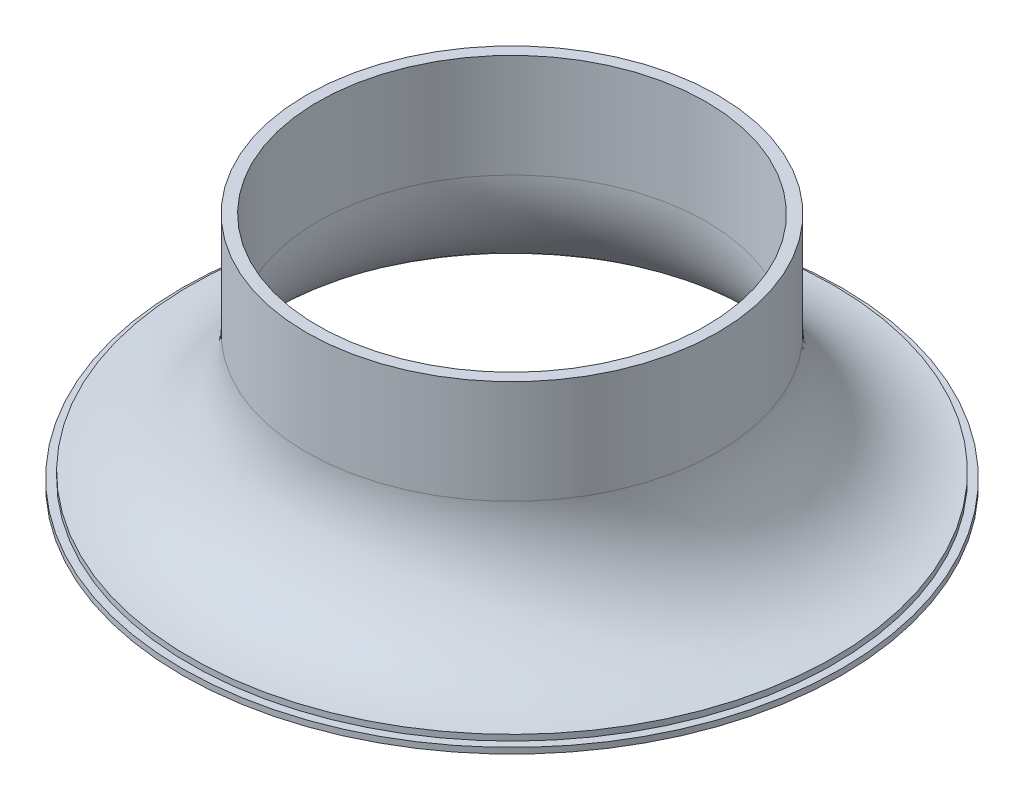
ISO-10303-21;
HEADER;
FILE_DESCRIPTION(('STEP AP214'),'2;1');
FILE_NAME('part.step','',(''),(''),'','','');
FILE_SCHEMA(('AUTOMOTIVE_DESIGN { 1 0 10303 214 1 1 1 1 }'));
ENDSEC;
DATA;
#1=APPLICATION_CONTEXT('core data for automotive mechanical design processes');
#2=APPLICATION_PROTOCOL_DEFINITION('international standard','automotive_design',2000,#1);
#3=PRODUCT_CONTEXT('',#1,'mechanical');
#4=PRODUCT('Part','Part','',(#3));
#5=PRODUCT_RELATED_PRODUCT_CATEGORY('part','',(#4));
#6=PRODUCT_DEFINITION_FORMATION('','',#4);
#7=PRODUCT_DEFINITION_CONTEXT('part definition',#1,'design');
#8=PRODUCT_DEFINITION('design','',#6,#7);
#9=PRODUCT_DEFINITION_SHAPE('','',#8);
#10=(LENGTH_UNIT() NAMED_UNIT(*) SI_UNIT(.MILLI.,.METRE.));
#11=(NAMED_UNIT(*) PLANE_ANGLE_UNIT() SI_UNIT($,.RADIAN.));
#12=(NAMED_UNIT(*) SI_UNIT($,.STERADIAN.) SOLID_ANGLE_UNIT());
#13=UNCERTAINTY_MEASURE_WITH_UNIT(LENGTH_MEASURE(1.E-05),#10,'distance_accuracy_value','');
#14=(GEOMETRIC_REPRESENTATION_CONTEXT(3) GLOBAL_UNCERTAINTY_ASSIGNED_CONTEXT((#13)) GLOBAL_UNIT_ASSIGNED_CONTEXT((#10,
#11,#12)) REPRESENTATION_CONTEXT('',''));
#15=CARTESIAN_POINT('',(0.,0.,0.));
#16=DIRECTION('',(0.,0.,1.));
#17=DIRECTION('',(1.,0.,0.));
#18=AXIS2_PLACEMENT_3D('',#15,#16,#17);
#19=CARTESIAN_POINT('',(-26.6,9.27041549062227,0.));
#20=DIRECTION('',(0.,-1.,0.));
#21=DIRECTION('',(0.,0.,-1.));
#22=AXIS2_PLACEMENT_3D('',#19,#20,#21);
#23=PLANE('',#22);
#24=CARTESIAN_POINT('',(0.,9.27041549062227,0.));
#25=DIRECTION('',(0.,-1.,0.));
#26=DIRECTION('',(0.,0.,-1.));
#27=AXIS2_PLACEMENT_3D('',#24,#25,#26);
#28=CIRCLE('',#27,26.6);
#29=CARTESIAN_POINT('',(0.,9.27041549062227,-26.6));
#30=VERTEX_POINT('',#29);
#31=EDGE_CURVE('E10',#30,#30,#28,.T.);
#32=ORIENTED_EDGE('',*,*,#31,.F.);
#33=EDGE_LOOP('',(#32));
#34=FACE_BOUND('',#33,.T.);
#35=CARTESIAN_POINT('',(0.,9.27041549062227,0.));
#36=DIRECTION('',(0.,-1.,0.));
#37=DIRECTION('',(0.,0.,-1.));
#38=AXIS2_PLACEMENT_3D('',#35,#36,#37);
#39=CIRCLE('',#38,25.1);
#40=CARTESIAN_POINT('',(0.,9.27041549062227,-25.1));
#41=VERTEX_POINT('',#40);
#42=EDGE_CURVE('E78',#41,#41,#39,.T.);
#43=ORIENTED_EDGE('',*,*,#42,.T.);
#44=EDGE_LOOP('',(#43));
#45=FACE_BOUND('',#44,.T.);
#46=ADVANCED_FACE('F39',(#34,#45),#23,.F.);
#47=CARTESIAN_POINT('',(0.,0.,0.));
#48=DIRECTION('',(0.,-1.,0.));
#49=DIRECTION('',(0.,0.,-1.));
#50=AXIS2_PLACEMENT_3D('',#47,#48,#49);
#51=CYLINDRICAL_SURFACE('',#50,26.6);
#52=CARTESIAN_POINT('',(0.,-4.12958450937773,0.));
#53=DIRECTION('',(0.,-1.,0.));
#54=DIRECTION('',(0.,0.,-1.));
#55=AXIS2_PLACEMENT_3D('',#52,#53,#54);
#56=CIRCLE('',#55,26.6);
#57=CARTESIAN_POINT('',(0.,-4.12958450937773,-26.6));
#58=VERTEX_POINT('',#57);
#59=EDGE_CURVE('E46',#58,#58,#56,.T.);
#60=ORIENTED_EDGE('',*,*,#59,.F.);
#61=EDGE_LOOP('',(#60));
#62=FACE_BOUND('',#61,.T.);
#63=ORIENTED_EDGE('',*,*,#31,.T.);
#64=EDGE_LOOP('',(#63));
#65=FACE_BOUND('',#64,.T.);
#66=ADVANCED_FACE('F122',(#62,#65),#51,.T.);
#67=CARTESIAN_POINT('',(0.,-4.12958450937773,0.));
#68=DIRECTION('',(0.,-1.,0.));
#69=DIRECTION('',(0.,0.,-1.));
#70=AXIS2_PLACEMENT_3D('',#67,#68,#69);
#71=TOROIDAL_SURFACE('',#70,42.06,15.46);
#72=CARTESIAN_POINT('',(0.,-19.5841469425235,0.));
#73=DIRECTION('',(0.,-1.,0.));
#74=DIRECTION('',(0.,0.,-1.));
#75=AXIS2_PLACEMENT_3D('',#72,#73,#74);
#76=CIRCLE('',#75,41.65);
#77=CARTESIAN_POINT('',(0.,-19.5841469425235,-41.65));
#78=VERTEX_POINT('',#77);
#79=EDGE_CURVE('E51',#78,#78,#76,.T.);
#80=ORIENTED_EDGE('',*,*,#79,.F.);
#81=EDGE_LOOP('',(#80));
#82=FACE_BOUND('',#81,.T.);
#83=ORIENTED_EDGE('',*,*,#59,.T.);
#84=EDGE_LOOP('',(#83));
#85=FACE_BOUND('',#84,.T.);
#86=ADVANCED_FACE('F117',(#82,#85),#71,.F.);
#87=CARTESIAN_POINT('',(0.,0.,0.));
#88=DIRECTION('',(0.,-1.,0.));
#89=DIRECTION('',(0.,0.,-1.));
#90=AXIS2_PLACEMENT_3D('',#87,#88,#89);
#91=CYLINDRICAL_SURFACE('',#90,41.65);
#92=CARTESIAN_POINT('',(0.,-20.3395845093777,0.));
#93=DIRECTION('',(0.,-1.,0.));
#94=DIRECTION('',(0.,0.,-1.));
#95=AXIS2_PLACEMENT_3D('',#92,#93,#94);
#96=CIRCLE('',#95,41.65);
#97=CARTESIAN_POINT('',(0.,-20.3395845093777,-41.65));
#98=VERTEX_POINT('',#97);
#99=EDGE_CURVE('E56',#98,#98,#96,.T.);
#100=ORIENTED_EDGE('',*,*,#99,.F.);
#101=EDGE_LOOP('',(#100));
#102=FACE_BOUND('',#101,.T.);
#103=ORIENTED_EDGE('',*,*,#79,.T.);
#104=EDGE_LOOP('',(#103));
#105=FACE_BOUND('',#104,.T.);
#106=ADVANCED_FACE('F111',(#102,#105),#91,.T.);
#107=CARTESIAN_POINT('',(-42.65,-20.3395845093777,0.));
#108=DIRECTION('',(0.,-1.,0.));
#109=DIRECTION('',(0.,0.,-1.));
#110=AXIS2_PLACEMENT_3D('',#107,#108,#109);
#111=PLANE('',#110);
#112=CARTESIAN_POINT('',(0.,-20.3395845093777,0.));
#113=DIRECTION('',(0.,-1.,0.));
#114=DIRECTION('',(0.,0.,-1.));
#115=AXIS2_PLACEMENT_3D('',#112,#113,#114);
#116=CIRCLE('',#115,42.65);
#117=CARTESIAN_POINT('',(0.,-20.3395845093777,-42.65));
#118=VERTEX_POINT('',#117);
#119=EDGE_CURVE('E62',#118,#118,#116,.T.);
#120=ORIENTED_EDGE('',*,*,#119,.F.);
#121=EDGE_LOOP('',(#120));
#122=FACE_BOUND('',#121,.T.);
#123=ORIENTED_EDGE('',*,*,#99,.T.);
#124=EDGE_LOOP('',(#123));
#125=FACE_BOUND('',#124,.T.);
#126=ADVANCED_FACE('F105',(#122,#125),#111,.F.);
#127=CARTESIAN_POINT('',(0.,0.,0.));
#128=DIRECTION('',(0.,-1.,0.));
#129=DIRECTION('',(0.,0.,-1.));
#130=AXIS2_PLACEMENT_3D('',#127,#128,#129);
#131=CYLINDRICAL_SURFACE('',#130,42.65);
#132=CARTESIAN_POINT('',(0.,-21.0895845093777,0.));
#133=DIRECTION('',(0.,-1.,0.));
#134=DIRECTION('',(0.,0.,-1.));
#135=AXIS2_PLACEMENT_3D('',#132,#133,#134);
#136=CIRCLE('',#135,42.65);
#137=CARTESIAN_POINT('',(0.,-21.0895845093777,-42.65));
#138=VERTEX_POINT('',#137);
#139=EDGE_CURVE('E66',#138,#138,#136,.T.);
#140=ORIENTED_EDGE('',*,*,#139,.F.);
#141=EDGE_LOOP('',(#140));
#142=FACE_BOUND('',#141,.T.);
#143=ORIENTED_EDGE('',*,*,#119,.T.);
#144=EDGE_LOOP('',(#143));
#145=FACE_BOUND('',#144,.T.);
#146=ADVANCED_FACE('F99',(#142,#145),#131,.T.);
#147=CARTESIAN_POINT('',(-42.06,-21.0895845093777,0.));
#148=DIRECTION('',(0.,1.,0.));
#149=DIRECTION('',(0.,0.,1.));
#150=AXIS2_PLACEMENT_3D('',#147,#148,#149);
#151=PLANE('',#150);
#152=CARTESIAN_POINT('',(0.,-21.0895845093777,0.));
#153=DIRECTION('',(0.,-1.,0.));
#154=DIRECTION('',(0.,0.,-1.));
#155=AXIS2_PLACEMENT_3D('',#152,#153,#154);
#156=CIRCLE('',#155,42.06);
#157=CARTESIAN_POINT('',(0.,-21.0895845093777,-42.06));
#158=VERTEX_POINT('',#157);
#159=EDGE_CURVE('E70',#158,#158,#156,.T.);
#160=ORIENTED_EDGE('',*,*,#159,.F.);
#161=EDGE_LOOP('',(#160));
#162=FACE_BOUND('',#161,.T.);
#163=ORIENTED_EDGE('',*,*,#139,.T.);
#164=EDGE_LOOP('',(#163));
#165=FACE_BOUND('',#164,.T.);
#166=ADVANCED_FACE('F93',(#162,#165),#151,.F.);
#167=CARTESIAN_POINT('',(0.,-4.12958450937773,0.));
#168=DIRECTION('',(0.,-1.,0.));
#169=DIRECTION('',(0.,0.,-1.));
#170=AXIS2_PLACEMENT_3D('',#167,#168,#169);
#171=TOROIDAL_SURFACE('',#170,42.06,16.96);
#172=CARTESIAN_POINT('',(0.,-4.12958450937773,0.));
#173=DIRECTION('',(0.,-1.,0.));
#174=DIRECTION('',(0.,0.,-1.));
#175=AXIS2_PLACEMENT_3D('',#172,#173,#174);
#176=CIRCLE('',#175,25.1);
#177=CARTESIAN_POINT('',(0.,-4.12958450937773,-25.1));
#178=VERTEX_POINT('',#177);
#179=EDGE_CURVE('E74',#178,#178,#176,.T.);
#180=ORIENTED_EDGE('',*,*,#179,.F.);
#181=EDGE_LOOP('',(#180));
#182=FACE_BOUND('',#181,.T.);
#183=ORIENTED_EDGE('',*,*,#159,.T.);
#184=EDGE_LOOP('',(#183));
#185=FACE_BOUND('',#184,.T.);
#186=ADVANCED_FACE('F87',(#182,#185),#171,.T.);
#187=CARTESIAN_POINT('',(0.,0.,0.));
#188=DIRECTION('',(0.,-1.,0.));
#189=DIRECTION('',(0.,0.,-1.));
#190=AXIS2_PLACEMENT_3D('',#187,#188,#189);
#191=CYLINDRICAL_SURFACE('',#190,25.1);
#192=ORIENTED_EDGE('',*,*,#42,.F.);
#193=EDGE_LOOP('',(#192));
#194=FACE_BOUND('',#193,.T.);
#195=ORIENTED_EDGE('',*,*,#179,.T.);
#196=EDGE_LOOP('',(#195));
#197=FACE_BOUND('',#196,.T.);
#198=ADVANCED_FACE('F84',(#194,#197),#191,.F.);
#199=CLOSED_SHELL('',(#46,#66,#86,#106,#126,#146,#166,#186,#198));
#200=MANIFOLD_SOLID_BREP('B2',#199);
#201=ADVANCED_BREP_SHAPE_REPRESENTATION('',(#18,#200),#14);
#202=SHAPE_DEFINITION_REPRESENTATION(#9,#201);
ENDSEC;
END-ISO-10303-21;
